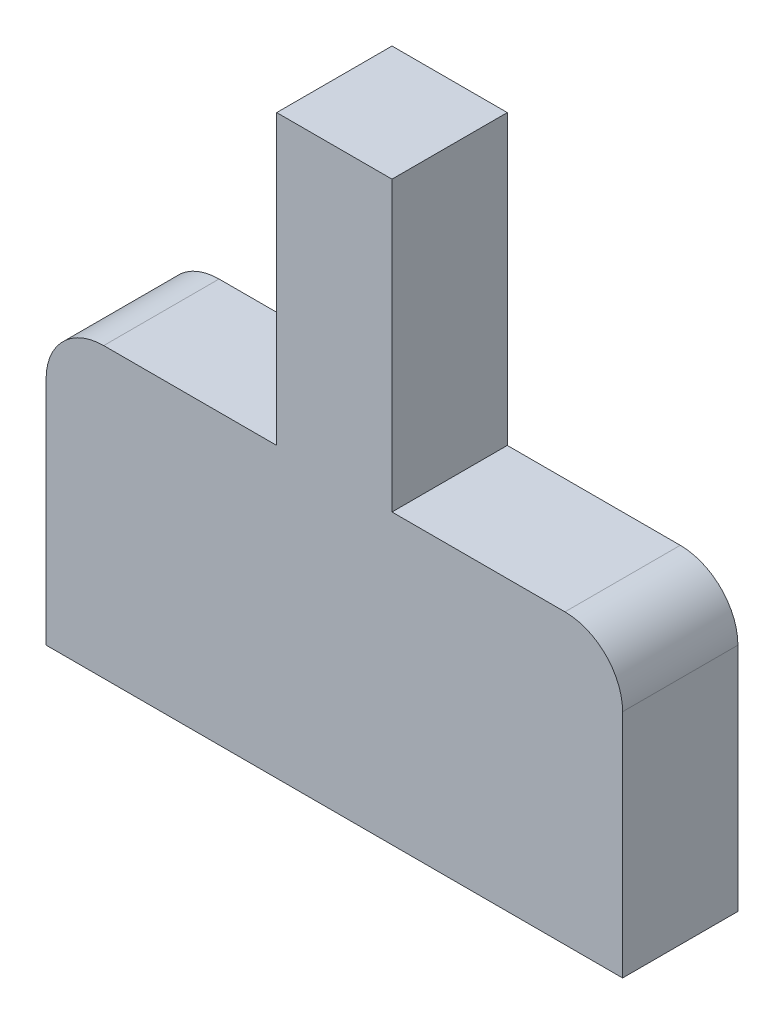
ISO-10303-21;
HEADER;
FILE_DESCRIPTION(('STEP AP214'),'2;1');
FILE_NAME('part.step','',(''),(''),'','','');
FILE_SCHEMA(('AUTOMOTIVE_DESIGN { 1 0 10303 214 1 1 1 1 }'));
ENDSEC;
DATA;
#1=APPLICATION_CONTEXT('core data for automotive mechanical design processes');
#2=APPLICATION_PROTOCOL_DEFINITION('international standard','automotive_design',2000,#1);
#3=PRODUCT_CONTEXT('',#1,'mechanical');
#4=PRODUCT('Part','Part','',(#3));
#5=PRODUCT_RELATED_PRODUCT_CATEGORY('part','',(#4));
#6=PRODUCT_DEFINITION_FORMATION('','',#4);
#7=PRODUCT_DEFINITION_CONTEXT('part definition',#1,'design');
#8=PRODUCT_DEFINITION('design','',#6,#7);
#9=PRODUCT_DEFINITION_SHAPE('','',#8);
#10=(LENGTH_UNIT() NAMED_UNIT(*) SI_UNIT(.MILLI.,.METRE.));
#11=(NAMED_UNIT(*) PLANE_ANGLE_UNIT() SI_UNIT($,.RADIAN.));
#12=(NAMED_UNIT(*) SI_UNIT($,.STERADIAN.) SOLID_ANGLE_UNIT());
#13=UNCERTAINTY_MEASURE_WITH_UNIT(LENGTH_MEASURE(1.E-05),#10,'distance_accuracy_value','');
#14=(GEOMETRIC_REPRESENTATION_CONTEXT(3) GLOBAL_UNCERTAINTY_ASSIGNED_CONTEXT((#13)) GLOBAL_UNIT_ASSIGNED_CONTEXT((#10,
#11,#12)) REPRESENTATION_CONTEXT('',''));
#15=CARTESIAN_POINT('',(0.,0.,0.));
#16=DIRECTION('',(0.,0.,1.));
#17=DIRECTION('',(1.,0.,0.));
#18=AXIS2_PLACEMENT_3D('',#15,#16,#17);
#19=CARTESIAN_POINT('',(-40.,0.,20.));
#20=DIRECTION('',(1.,0.,0.));
#21=DIRECTION('',(0.,0.,-1.));
#22=AXIS2_PLACEMENT_3D('',#19,#20,#21);
#23=PLANE('',#22);
#24=DIRECTION('',(0.,-1.,0.));
#25=VECTOR('',#24,1.);
#26=CARTESIAN_POINT('',(-40.,0.,0.));
#27=LINE('',#26,#25);
#28=CARTESIAN_POINT('',(-40.,40.,0.));
#29=VERTEX_POINT('',#28);
#30=CARTESIAN_POINT('',(-40.,0.,0.));
#31=VERTEX_POINT('',#30);
#32=EDGE_CURVE('E152',#29,#31,#27,.T.);
#33=ORIENTED_EDGE('',*,*,#32,.T.);
#34=DIRECTION('',(0.,0.,-1.));
#35=VECTOR('',#34,1.);
#36=CARTESIAN_POINT('',(-40.,0.,20.));
#37=LINE('',#36,#35);
#38=CARTESIAN_POINT('',(-40.,0.,20.));
#39=VERTEX_POINT('',#38);
#40=EDGE_CURVE('E11',#39,#31,#37,.T.);
#41=ORIENTED_EDGE('',*,*,#40,.F.);
#42=DIRECTION('',(0.,-1.,0.));
#43=VECTOR('',#42,1.);
#44=CARTESIAN_POINT('',(-40.,0.,20.));
#45=LINE('',#44,#43);
#46=CARTESIAN_POINT('',(-40.,40.,20.));
#47=VERTEX_POINT('',#46);
#48=EDGE_CURVE('E180',#47,#39,#45,.T.);
#49=ORIENTED_EDGE('',*,*,#48,.F.);
#50=DIRECTION('',(0.,0.,-1.));
#51=VECTOR('',#50,1.);
#52=CARTESIAN_POINT('',(-40.,40.,20.));
#53=LINE('',#52,#51);
#54=EDGE_CURVE('E148',#47,#29,#53,.T.);
#55=ORIENTED_EDGE('',*,*,#54,.T.);
#56=EDGE_LOOP('',(#33,#41,#49,#55));
#57=FACE_BOUND('',#56,.T.);
#58=ADVANCED_FACE('F39',(#57),#23,.F.);
#59=CARTESIAN_POINT('',(-40.,0.,20.));
#60=DIRECTION('',(0.,1.,0.));
#61=DIRECTION('',(0.,0.,1.));
#62=AXIS2_PLACEMENT_3D('',#59,#60,#61);
#63=PLANE('',#62);
#64=DIRECTION('',(1.,0.,0.));
#65=VECTOR('',#64,1.);
#66=CARTESIAN_POINT('',(-40.,0.,0.));
#67=LINE('',#66,#65);
#68=CARTESIAN_POINT('',(60.,0.,0.));
#69=VERTEX_POINT('',#68);
#70=EDGE_CURVE('E156',#31,#69,#67,.T.);
#71=ORIENTED_EDGE('',*,*,#70,.T.);
#72=DIRECTION('',(0.,0.,-1.));
#73=VECTOR('',#72,1.);
#74=CARTESIAN_POINT('',(60.,0.,20.));
#75=LINE('',#74,#73);
#76=CARTESIAN_POINT('',(60.,0.,20.));
#77=VERTEX_POINT('',#76);
#78=EDGE_CURVE('E48',#77,#69,#75,.T.);
#79=ORIENTED_EDGE('',*,*,#78,.F.);
#80=DIRECTION('',(1.,0.,0.));
#81=VECTOR('',#80,1.);
#82=CARTESIAN_POINT('',(-40.,0.,20.));
#83=LINE('',#82,#81);
#84=EDGE_CURVE('E105',#39,#77,#83,.T.);
#85=ORIENTED_EDGE('',*,*,#84,.F.);
#86=ORIENTED_EDGE('',*,*,#40,.T.);
#87=EDGE_LOOP('',(#71,#79,#85,#86));
#88=FACE_BOUND('',#87,.T.);
#89=ADVANCED_FACE('F244',(#88),#63,.F.);
#90=CARTESIAN_POINT('',(60.,0.,20.));
#91=DIRECTION('',(-1.,0.,0.));
#92=DIRECTION('',(0.,0.,1.));
#93=AXIS2_PLACEMENT_3D('',#90,#91,#92);
#94=PLANE('',#93);
#95=DIRECTION('',(0.,1.,0.));
#96=VECTOR('',#95,1.);
#97=CARTESIAN_POINT('',(60.,0.,0.));
#98=LINE('',#97,#96);
#99=CARTESIAN_POINT('',(60.,40.,0.));
#100=VERTEX_POINT('',#99);
#101=EDGE_CURVE('E159',#69,#100,#98,.T.);
#102=ORIENTED_EDGE('',*,*,#101,.T.);
#103=DIRECTION('',(0.,0.,-1.));
#104=VECTOR('',#103,1.);
#105=CARTESIAN_POINT('',(60.,40.,20.));
#106=LINE('',#105,#104);
#107=CARTESIAN_POINT('',(60.,40.,20.));
#108=VERTEX_POINT('',#107);
#109=EDGE_CURVE('E199',#108,#100,#106,.T.);
#110=ORIENTED_EDGE('',*,*,#109,.F.);
#111=DIRECTION('',(0.,1.,0.));
#112=VECTOR('',#111,1.);
#113=CARTESIAN_POINT('',(60.,0.,20.));
#114=LINE('',#113,#112);
#115=EDGE_CURVE('E209',#77,#108,#114,.T.);
#116=ORIENTED_EDGE('',*,*,#115,.F.);
#117=ORIENTED_EDGE('',*,*,#78,.T.);
#118=EDGE_LOOP('',(#102,#110,#116,#117));
#119=FACE_BOUND('',#118,.T.);
#120=ADVANCED_FACE('F207',(#119),#94,.F.);
#121=CARTESIAN_POINT('',(50.,40.,20.));
#122=DIRECTION('',(0.,0.,-1.));
#123=DIRECTION('',(-1.,0.,0.));
#124=AXIS2_PLACEMENT_3D('',#121,#122,#123);
#125=CYLINDRICAL_SURFACE('',#124,10.);
#126=CARTESIAN_POINT('',(50.,40.,0.));
#127=DIRECTION('',(0.,0.,1.));
#128=DIRECTION('',(1.,0.,0.));
#129=AXIS2_PLACEMENT_3D('',#126,#127,#128);
#130=CIRCLE('',#129,10.);
#131=CARTESIAN_POINT('',(50.,50.,0.));
#132=VERTEX_POINT('',#131);
#133=EDGE_CURVE('E162',#100,#132,#130,.T.);
#134=ORIENTED_EDGE('',*,*,#133,.T.);
#135=DIRECTION('',(0.,0.,-1.));
#136=VECTOR('',#135,1.);
#137=CARTESIAN_POINT('',(50.,50.,20.));
#138=LINE('',#137,#136);
#139=CARTESIAN_POINT('',(50.,50.,20.));
#140=VERTEX_POINT('',#139);
#141=EDGE_CURVE('E195',#140,#132,#138,.T.);
#142=ORIENTED_EDGE('',*,*,#141,.F.);
#143=CARTESIAN_POINT('',(50.,40.,20.));
#144=DIRECTION('',(0.,0.,1.));
#145=DIRECTION('',(1.,0.,0.));
#146=AXIS2_PLACEMENT_3D('',#143,#144,#145);
#147=CIRCLE('',#146,10.);
#148=EDGE_CURVE('E228',#108,#140,#147,.T.);
#149=ORIENTED_EDGE('',*,*,#148,.F.);
#150=ORIENTED_EDGE('',*,*,#109,.T.);
#151=EDGE_LOOP('',(#134,#142,#149,#150));
#152=FACE_BOUND('',#151,.T.);
#153=ADVANCED_FACE('F218',(#152),#125,.T.);
#154=CARTESIAN_POINT('',(20.,50.,20.));
#155=DIRECTION('',(0.,-1.,0.));
#156=DIRECTION('',(0.,0.,-1.));
#157=AXIS2_PLACEMENT_3D('',#154,#155,#156);
#158=PLANE('',#157);
#159=DIRECTION('',(-1.,0.,0.));
#160=VECTOR('',#159,1.);
#161=CARTESIAN_POINT('',(20.,50.,0.));
#162=LINE('',#161,#160);
#163=CARTESIAN_POINT('',(20.,50.,0.));
#164=VERTEX_POINT('',#163);
#165=EDGE_CURVE('E165',#132,#164,#162,.T.);
#166=ORIENTED_EDGE('',*,*,#165,.T.);
#167=DIRECTION('',(0.,0.,-1.));
#168=VECTOR('',#167,1.);
#169=CARTESIAN_POINT('',(20.,50.,20.));
#170=LINE('',#169,#168);
#171=CARTESIAN_POINT('',(20.,50.,20.));
#172=VERTEX_POINT('',#171);
#173=EDGE_CURVE('E191',#172,#164,#170,.T.);
#174=ORIENTED_EDGE('',*,*,#173,.F.);
#175=DIRECTION('',(-1.,0.,0.));
#176=VECTOR('',#175,1.);
#177=CARTESIAN_POINT('',(20.,50.,20.));
#178=LINE('',#177,#176);
#179=EDGE_CURVE('E224',#140,#172,#178,.T.);
#180=ORIENTED_EDGE('',*,*,#179,.F.);
#181=ORIENTED_EDGE('',*,*,#141,.T.);
#182=EDGE_LOOP('',(#166,#174,#180,#181));
#183=FACE_BOUND('',#182,.T.);
#184=ADVANCED_FACE('F222',(#183),#158,.F.);
#185=CARTESIAN_POINT('',(20.,50.,20.));
#186=DIRECTION('',(-1.,0.,0.));
#187=DIRECTION('',(0.,0.,1.));
#188=AXIS2_PLACEMENT_3D('',#185,#186,#187);
#189=PLANE('',#188);
#190=DIRECTION('',(0.,1.,0.));
#191=VECTOR('',#190,1.);
#192=CARTESIAN_POINT('',(20.,50.,0.));
#193=LINE('',#192,#191);
#194=CARTESIAN_POINT('',(20.,100.,0.));
#195=VERTEX_POINT('',#194);
#196=EDGE_CURVE('E168',#164,#195,#193,.T.);
#197=ORIENTED_EDGE('',*,*,#196,.T.);
#198=DIRECTION('',(0.,0.,-1.));
#199=VECTOR('',#198,1.);
#200=CARTESIAN_POINT('',(20.,100.,20.));
#201=LINE('',#200,#199);
#202=CARTESIAN_POINT('',(20.,100.,20.));
#203=VERTEX_POINT('',#202);
#204=EDGE_CURVE('E187',#203,#195,#201,.T.);
#205=ORIENTED_EDGE('',*,*,#204,.F.);
#206=DIRECTION('',(0.,1.,0.));
#207=VECTOR('',#206,1.);
#208=CARTESIAN_POINT('',(20.,50.,20.));
#209=LINE('',#208,#207);
#210=EDGE_CURVE('E227',#172,#203,#209,.T.);
#211=ORIENTED_EDGE('',*,*,#210,.F.);
#212=ORIENTED_EDGE('',*,*,#173,.T.);
#213=EDGE_LOOP('',(#197,#205,#211,#212));
#214=FACE_BOUND('',#213,.T.);
#215=ADVANCED_FACE('F256',(#214),#189,.F.);
#216=CARTESIAN_POINT('',(20.,100.,20.));
#217=DIRECTION('',(0.,-1.,0.));
#218=DIRECTION('',(0.,0.,-1.));
#219=AXIS2_PLACEMENT_3D('',#216,#217,#218);
#220=PLANE('',#219);
#221=DIRECTION('',(-1.,0.,0.));
#222=VECTOR('',#221,1.);
#223=CARTESIAN_POINT('',(20.,100.,0.));
#224=LINE('',#223,#222);
#225=CARTESIAN_POINT('',(0.,100.,0.));
#226=VERTEX_POINT('',#225);
#227=EDGE_CURVE('E171',#195,#226,#224,.T.);
#228=ORIENTED_EDGE('',*,*,#227,.T.);
#229=DIRECTION('',(0.,0.,-1.));
#230=VECTOR('',#229,1.);
#231=CARTESIAN_POINT('',(0.,100.,20.));
#232=LINE('',#231,#230);
#233=CARTESIAN_POINT('',(0.,100.,20.));
#234=VERTEX_POINT('',#233);
#235=EDGE_CURVE('E141',#234,#226,#232,.T.);
#236=ORIENTED_EDGE('',*,*,#235,.F.);
#237=DIRECTION('',(-1.,0.,0.));
#238=VECTOR('',#237,1.);
#239=CARTESIAN_POINT('',(20.,100.,20.));
#240=LINE('',#239,#238);
#241=EDGE_CURVE('E130',#203,#234,#240,.T.);
#242=ORIENTED_EDGE('',*,*,#241,.F.);
#243=ORIENTED_EDGE('',*,*,#204,.T.);
#244=EDGE_LOOP('',(#228,#236,#242,#243));
#245=FACE_BOUND('',#244,.T.);
#246=ADVANCED_FACE('F259',(#245),#220,.F.);
#247=CARTESIAN_POINT('',(0.,100.,20.));
#248=DIRECTION('',(1.,0.,0.));
#249=DIRECTION('',(0.,1.,0.));
#250=AXIS2_PLACEMENT_3D('',#247,#248,#249);
#251=PLANE('',#250);
#252=DIRECTION('',(0.,-1.,0.));
#253=VECTOR('',#252,1.);
#254=CARTESIAN_POINT('',(0.,100.,0.));
#255=LINE('',#254,#253);
#256=CARTESIAN_POINT('',(0.,50.,0.));
#257=VERTEX_POINT('',#256);
#258=EDGE_CURVE('E139',#226,#257,#255,.T.);
#259=ORIENTED_EDGE('',*,*,#258,.T.);
#260=DIRECTION('',(0.,0.,-1.));
#261=VECTOR('',#260,1.);
#262=CARTESIAN_POINT('',(0.,50.,20.));
#263=LINE('',#262,#261);
#264=CARTESIAN_POINT('',(0.,50.,20.));
#265=VERTEX_POINT('',#264);
#266=EDGE_CURVE('E136',#265,#257,#263,.T.);
#267=ORIENTED_EDGE('',*,*,#266,.F.);
#268=DIRECTION('',(0.,-1.,0.));
#269=VECTOR('',#268,1.);
#270=CARTESIAN_POINT('',(0.,100.,20.));
#271=LINE('',#270,#269);
#272=EDGE_CURVE('E124',#234,#265,#271,.T.);
#273=ORIENTED_EDGE('',*,*,#272,.F.);
#274=ORIENTED_EDGE('',*,*,#235,.T.);
#275=EDGE_LOOP('',(#259,#267,#273,#274));
#276=FACE_BOUND('',#275,.T.);
#277=ADVANCED_FACE('F137',(#276),#251,.F.);
#278=CARTESIAN_POINT('',(-30.,50.,20.));
#279=DIRECTION('',(0.,-1.,0.));
#280=DIRECTION('',(0.,0.,-1.));
#281=AXIS2_PLACEMENT_3D('',#278,#279,#280);
#282=PLANE('',#281);
#283=DIRECTION('',(-1.,0.,0.));
#284=VECTOR('',#283,1.);
#285=CARTESIAN_POINT('',(-30.,50.,0.));
#286=LINE('',#285,#284);
#287=CARTESIAN_POINT('',(-30.,50.,0.));
#288=VERTEX_POINT('',#287);
#289=EDGE_CURVE('E91',#257,#288,#286,.T.);
#290=ORIENTED_EDGE('',*,*,#289,.T.);
#291=DIRECTION('',(0.,0.,-1.));
#292=VECTOR('',#291,1.);
#293=CARTESIAN_POINT('',(-30.,50.,20.));
#294=LINE('',#293,#292);
#295=CARTESIAN_POINT('',(-30.,50.,20.));
#296=VERTEX_POINT('',#295);
#297=EDGE_CURVE('E142',#296,#288,#294,.T.);
#298=ORIENTED_EDGE('',*,*,#297,.F.);
#299=DIRECTION('',(-1.,0.,0.));
#300=VECTOR('',#299,1.);
#301=CARTESIAN_POINT('',(-30.,50.,20.));
#302=LINE('',#301,#300);
#303=EDGE_CURVE('E128',#265,#296,#302,.T.);
#304=ORIENTED_EDGE('',*,*,#303,.F.);
#305=ORIENTED_EDGE('',*,*,#266,.T.);
#306=EDGE_LOOP('',(#290,#298,#304,#305));
#307=FACE_BOUND('',#306,.T.);
#308=ADVANCED_FACE('F144',(#307),#282,.F.);
#309=CARTESIAN_POINT('',(-30.,40.,20.));
#310=DIRECTION('',(0.,0.,-1.));
#311=DIRECTION('',(-1.,0.,0.));
#312=AXIS2_PLACEMENT_3D('',#309,#310,#311);
#313=CYLINDRICAL_SURFACE('',#312,10.);
#314=CARTESIAN_POINT('',(-30.,40.,0.));
#315=DIRECTION('',(0.,0.,1.));
#316=DIRECTION('',(1.,0.,0.));
#317=AXIS2_PLACEMENT_3D('',#314,#315,#316);
#318=CIRCLE('',#317,10.);
#319=EDGE_CURVE('E97',#288,#29,#318,.T.);
#320=ORIENTED_EDGE('',*,*,#319,.T.);
#321=ORIENTED_EDGE('',*,*,#54,.F.);
#322=CARTESIAN_POINT('',(-30.,40.,20.));
#323=DIRECTION('',(0.,0.,1.));
#324=DIRECTION('',(1.,0.,0.));
#325=AXIS2_PLACEMENT_3D('',#322,#323,#324);
#326=CIRCLE('',#325,10.);
#327=EDGE_CURVE('E56',#296,#47,#326,.T.);
#328=ORIENTED_EDGE('',*,*,#327,.F.);
#329=ORIENTED_EDGE('',*,*,#297,.T.);
#330=EDGE_LOOP('',(#320,#321,#328,#329));
#331=FACE_BOUND('',#330,.T.);
#332=ADVANCED_FACE('F268',(#331),#313,.T.);
#333=CARTESIAN_POINT('',(-30.,40.,20.));
#334=DIRECTION('',(0.,0.,1.));
#335=DIRECTION('',(1.,0.,0.));
#336=AXIS2_PLACEMENT_3D('',#333,#334,#335);
#337=PLANE('',#336);
#338=ORIENTED_EDGE('',*,*,#48,.T.);
#339=ORIENTED_EDGE('',*,*,#84,.T.);
#340=ORIENTED_EDGE('',*,*,#115,.T.);
#341=ORIENTED_EDGE('',*,*,#148,.T.);
#342=ORIENTED_EDGE('',*,*,#179,.T.);
#343=ORIENTED_EDGE('',*,*,#210,.T.);
#344=ORIENTED_EDGE('',*,*,#241,.T.);
#345=ORIENTED_EDGE('',*,*,#272,.T.);
#346=ORIENTED_EDGE('',*,*,#303,.T.);
#347=ORIENTED_EDGE('',*,*,#327,.T.);
#348=EDGE_LOOP('',(#338,#339,#340,#341,#342,#343,#344,#345,#346,#347));
#349=FACE_BOUND('',#348,.T.);
#350=ADVANCED_FACE('F126',(#349),#337,.T.);
#351=CARTESIAN_POINT('',(-30.,40.,0.));
#352=DIRECTION('',(0.,0.,1.));
#353=DIRECTION('',(1.,0.,0.));
#354=AXIS2_PLACEMENT_3D('',#351,#352,#353);
#355=PLANE('',#354);
#356=ORIENTED_EDGE('',*,*,#32,.F.);
#357=ORIENTED_EDGE('',*,*,#319,.F.);
#358=ORIENTED_EDGE('',*,*,#289,.F.);
#359=ORIENTED_EDGE('',*,*,#258,.F.);
#360=ORIENTED_EDGE('',*,*,#227,.F.);
#361=ORIENTED_EDGE('',*,*,#196,.F.);
#362=ORIENTED_EDGE('',*,*,#165,.F.);
#363=ORIENTED_EDGE('',*,*,#133,.F.);
#364=ORIENTED_EDGE('',*,*,#101,.F.);
#365=ORIENTED_EDGE('',*,*,#70,.F.);
#366=EDGE_LOOP('',(#356,#357,#358,#359,#360,#361,#362,#363,#364,#365));
#367=FACE_BOUND('',#366,.T.);
#368=ADVANCED_FACE('F213',(#367),#355,.F.);
#369=CLOSED_SHELL('',(#58,#89,#120,#153,#184,#215,#246,#277,#308,#332,#350,#368));
#370=MANIFOLD_SOLID_BREP('B2',#369);
#371=ADVANCED_BREP_SHAPE_REPRESENTATION('',(#18,#370),#14);
#372=SHAPE_DEFINITION_REPRESENTATION(#9,#371);
ENDSEC;
END-ISO-10303-21;
